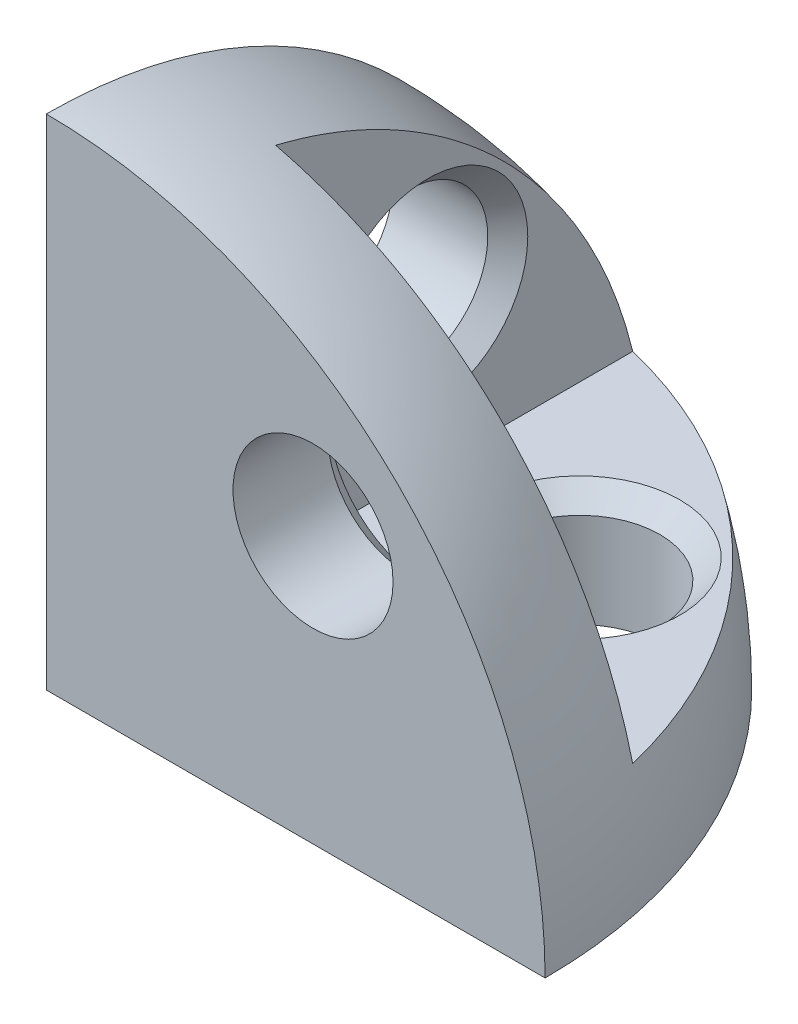
ISO-10303-21;
HEADER;
FILE_DESCRIPTION(('STEP AP214'),'2;1');
FILE_NAME('part.step','',(''),(''),'','','');
FILE_SCHEMA(('AUTOMOTIVE_DESIGN { 1 0 10303 214 1 1 1 1 }'));
ENDSEC;
DATA;
#1=APPLICATION_CONTEXT('core data for automotive mechanical design processes');
#2=APPLICATION_PROTOCOL_DEFINITION('international standard','automotive_design',2000,#1);
#3=PRODUCT_CONTEXT('',#1,'mechanical');
#4=PRODUCT('Part','Part','',(#3));
#5=PRODUCT_RELATED_PRODUCT_CATEGORY('part','',(#4));
#6=PRODUCT_DEFINITION_FORMATION('','',#4);
#7=PRODUCT_DEFINITION_CONTEXT('part definition',#1,'design');
#8=PRODUCT_DEFINITION('design','',#6,#7);
#9=PRODUCT_DEFINITION_SHAPE('','',#8);
#10=(LENGTH_UNIT() NAMED_UNIT(*) SI_UNIT(.MILLI.,.METRE.));
#11=(NAMED_UNIT(*) PLANE_ANGLE_UNIT() SI_UNIT($,.RADIAN.));
#12=(NAMED_UNIT(*) SI_UNIT($,.STERADIAN.) SOLID_ANGLE_UNIT());
#13=UNCERTAINTY_MEASURE_WITH_UNIT(LENGTH_MEASURE(1.E-05),#10,'distance_accuracy_value','');
#14=(GEOMETRIC_REPRESENTATION_CONTEXT(3) GLOBAL_UNCERTAINTY_ASSIGNED_CONTEXT((#13)) GLOBAL_UNIT_ASSIGNED_CONTEXT((#10,
#11,#12)) REPRESENTATION_CONTEXT('',''));
#15=CARTESIAN_POINT('',(0.,0.,0.));
#16=DIRECTION('',(0.,0.,1.));
#17=DIRECTION('',(1.,0.,0.));
#18=AXIS2_PLACEMENT_3D('',#15,#16,#17);
#19=CARTESIAN_POINT('',(0.,0.,0.));
#20=DIRECTION('',(0.,-1.,0.));
#21=DIRECTION('',(0.,0.,-1.));
#22=AXIS2_PLACEMENT_3D('',#19,#20,#21);
#23=SPHERICAL_SURFACE('',#22,18.7);
#24=CARTESIAN_POINT('',(0.,0.,0.));
#25=DIRECTION('',(0.,0.,1.));
#26=DIRECTION('',(1.,0.,0.));
#27=AXIS2_PLACEMENT_3D('',#24,#25,#26);
#28=CIRCLE('',#27,18.7);
#29=CARTESIAN_POINT('',(18.7,0.,0.));
#30=VERTEX_POINT('',#29);
#31=CARTESIAN_POINT('',(0.,18.7,0.));
#32=VERTEX_POINT('',#31);
#33=EDGE_CURVE('E102',#30,#32,#28,.T.);
#34=ORIENTED_EDGE('',*,*,#33,.F.);
#35=CARTESIAN_POINT('',(0.,0.,0.));
#36=DIRECTION('',(0.,-1.,0.));
#37=DIRECTION('',(0.,0.,-1.));
#38=AXIS2_PLACEMENT_3D('',#35,#36,#37);
#39=CIRCLE('',#38,18.7);
#40=CARTESIAN_POINT('',(0.,0.,-18.7));
#41=VERTEX_POINT('',#40);
#42=EDGE_CURVE('E112',#41,#30,#39,.T.);
#43=ORIENTED_EDGE('',*,*,#42,.F.);
#44=CARTESIAN_POINT('',(0.,0.,0.));
#45=DIRECTION('',(1.,0.,0.));
#46=DIRECTION('',(0.,0.,-1.));
#47=AXIS2_PLACEMENT_3D('',#44,#45,#46);
#48=CIRCLE('',#47,18.7);
#49=EDGE_CURVE('E107',#41,#32,#48,.T.);
#50=ORIENTED_EDGE('',*,*,#49,.T.);
#51=EDGE_LOOP('',(#34,#43,#50));
#52=FACE_BOUND('',#51,.T.);
#53=CARTESIAN_POINT('',(0.,4.3,0.));
#54=DIRECTION('',(0.,-1.,0.));
#55=DIRECTION('',(0.,0.,-1.));
#56=AXIS2_PLACEMENT_3D('',#53,#54,#55);
#57=CIRCLE('',#56,18.1989010657237);
#58=CARTESIAN_POINT('',(4.29999999999994,4.3,-17.6836082290917));
#59=VERTEX_POINT('',#58);
#60=CARTESIAN_POINT('',(17.6836082290917,4.3,-4.3));
#61=VERTEX_POINT('',#60);
#62=EDGE_CURVE('E91',#59,#61,#57,.T.);
#63=ORIENTED_EDGE('',*,*,#62,.T.);
#64=CARTESIAN_POINT('',(0.,0.,-4.3));
#65=DIRECTION('',(0.,0.,1.));
#66=DIRECTION('',(1.,0.,0.));
#67=AXIS2_PLACEMENT_3D('',#64,#65,#66);
#68=CIRCLE('',#67,18.1989010657237);
#69=CARTESIAN_POINT('',(4.29999999999999,17.6836082290917,-4.3));
#70=VERTEX_POINT('',#69);
#71=EDGE_CURVE('E85',#61,#70,#68,.T.);
#72=ORIENTED_EDGE('',*,*,#71,.T.);
#73=CARTESIAN_POINT('',(4.3,0.,0.));
#74=DIRECTION('',(1.,0.,0.));
#75=DIRECTION('',(0.,0.,-1.));
#76=AXIS2_PLACEMENT_3D('',#73,#74,#75);
#77=CIRCLE('',#76,18.1989010657237);
#78=EDGE_CURVE('E93',#59,#70,#77,.T.);
#79=ORIENTED_EDGE('',*,*,#78,.F.);
#80=EDGE_LOOP('',(#63,#72,#79));
#81=FACE_BOUND('',#80,.T.);
#82=ADVANCED_FACE('F38',(#52,#81),#23,.T.);
#83=CARTESIAN_POINT('',(0.,0.,0.));
#84=DIRECTION('',(0.,-1.,0.));
#85=DIRECTION('',(0.,0.,-1.));
#86=AXIS2_PLACEMENT_3D('',#83,#84,#85);
#87=PLANE('',#86);
#88=CARTESIAN_POINT('',(10.,0.,-10.));
#89=DIRECTION('',(0.,-1.,0.));
#90=DIRECTION('',(0.,0.,-1.));
#91=AXIS2_PLACEMENT_3D('',#88,#89,#90);
#92=CIRCLE('',#91,3.);
#93=CARTESIAN_POINT('',(10.,0.,-13.));
#94=VERTEX_POINT('',#93);
#95=EDGE_CURVE('E193',#94,#94,#92,.T.);
#96=ORIENTED_EDGE('',*,*,#95,.F.);
#97=EDGE_LOOP('',(#96));
#98=FACE_BOUND('',#97,.T.);
#99=ORIENTED_EDGE('',*,*,#42,.T.);
#100=DIRECTION('',(1.,0.,0.));
#101=VECTOR('',#100,1.);
#102=CARTESIAN_POINT('',(0.,0.,0.));
#103=LINE('',#102,#101);
#104=CARTESIAN_POINT('',(0.,0.,0.));
#105=VERTEX_POINT('',#104);
#106=EDGE_CURVE('E61',#105,#30,#103,.T.);
#107=ORIENTED_EDGE('',*,*,#106,.F.);
#108=DIRECTION('',(0.,0.,-1.));
#109=VECTOR('',#108,1.);
#110=CARTESIAN_POINT('',(0.,0.,0.));
#111=LINE('',#110,#109);
#112=EDGE_CURVE('E105',#105,#41,#111,.T.);
#113=ORIENTED_EDGE('',*,*,#112,.T.);
#114=EDGE_LOOP('',(#99,#107,#113));
#115=FACE_BOUND('',#114,.T.);
#116=ADVANCED_FACE('F139',(#98,#115),#87,.T.);
#117=CARTESIAN_POINT('',(0.,0.,0.));
#118=DIRECTION('',(1.,0.,0.));
#119=DIRECTION('',(0.,0.,-1.));
#120=AXIS2_PLACEMENT_3D('',#117,#118,#119);
#121=PLANE('',#120);
#122=CARTESIAN_POINT('',(0.,10.,-10.));
#123=DIRECTION('',(-1.,0.,0.));
#124=DIRECTION('',(0.,0.,1.));
#125=AXIS2_PLACEMENT_3D('',#122,#123,#124);
#126=CIRCLE('',#125,3.);
#127=CARTESIAN_POINT('',(0.,10.,-7.));
#128=VERTEX_POINT('',#127);
#129=EDGE_CURVE('E188',#128,#128,#126,.T.);
#130=ORIENTED_EDGE('',*,*,#129,.F.);
#131=EDGE_LOOP('',(#130));
#132=FACE_BOUND('',#131,.T.);
#133=ORIENTED_EDGE('',*,*,#112,.F.);
#134=DIRECTION('',(0.,1.,0.));
#135=VECTOR('',#134,1.);
#136=CARTESIAN_POINT('',(0.,0.,0.));
#137=LINE('',#136,#135);
#138=EDGE_CURVE('E110',#105,#32,#137,.T.);
#139=ORIENTED_EDGE('',*,*,#138,.T.);
#140=ORIENTED_EDGE('',*,*,#49,.F.);
#141=EDGE_LOOP('',(#133,#139,#140));
#142=FACE_BOUND('',#141,.T.);
#143=ADVANCED_FACE('F145',(#132,#142),#121,.F.);
#144=CARTESIAN_POINT('',(0.,0.,0.));
#145=DIRECTION('',(0.,0.,1.));
#146=DIRECTION('',(1.,0.,0.));
#147=AXIS2_PLACEMENT_3D('',#144,#145,#146);
#148=PLANE('',#147);
#149=CARTESIAN_POINT('',(10.,10.,0.));
#150=DIRECTION('',(0.,0.,1.));
#151=DIRECTION('',(1.,0.,0.));
#152=AXIS2_PLACEMENT_3D('',#149,#150,#151);
#153=CIRCLE('',#152,3.);
#154=CARTESIAN_POINT('',(13.,10.,0.));
#155=VERTEX_POINT('',#154);
#156=EDGE_CURVE('E88',#155,#155,#153,.T.);
#157=ORIENTED_EDGE('',*,*,#156,.F.);
#158=EDGE_LOOP('',(#157));
#159=FACE_BOUND('',#158,.T.);
#160=ORIENTED_EDGE('',*,*,#106,.T.);
#161=ORIENTED_EDGE('',*,*,#33,.T.);
#162=ORIENTED_EDGE('',*,*,#138,.F.);
#163=EDGE_LOOP('',(#160,#161,#162));
#164=FACE_BOUND('',#163,.T.);
#165=ADVANCED_FACE('F166',(#159,#164),#148,.T.);
#166=CARTESIAN_POINT('',(0.,4.3,0.));
#167=DIRECTION('',(0.,-1.,0.));
#168=DIRECTION('',(0.,0.,-1.));
#169=AXIS2_PLACEMENT_3D('',#166,#167,#168);
#170=PLANE('',#169);
#171=CARTESIAN_POINT('',(10.,4.3,-10.));
#172=DIRECTION('',(0.,-1.,0.));
#173=DIRECTION('',(0.,0.,-1.));
#174=AXIS2_PLACEMENT_3D('',#171,#172,#173);
#175=CIRCLE('',#174,3.75);
#176=CARTESIAN_POINT('',(10.,4.3,-13.75));
#177=VERTEX_POINT('',#176);
#178=EDGE_CURVE('E114',#177,#177,#175,.T.);
#179=ORIENTED_EDGE('',*,*,#178,.T.);
#180=EDGE_LOOP('',(#179));
#181=FACE_BOUND('',#180,.T.);
#182=ORIENTED_EDGE('',*,*,#62,.F.);
#183=DIRECTION('',(0.,0.,-1.));
#184=VECTOR('',#183,1.);
#185=CARTESIAN_POINT('',(4.3,4.3,0.));
#186=LINE('',#185,#184);
#187=CARTESIAN_POINT('',(4.29999999999999,4.3,-4.3));
#188=VERTEX_POINT('',#187);
#189=EDGE_CURVE('E53',#188,#59,#186,.T.);
#190=ORIENTED_EDGE('',*,*,#189,.F.);
#191=DIRECTION('',(1.,0.,0.));
#192=VECTOR('',#191,1.);
#193=CARTESIAN_POINT('',(0.,4.3,-4.3));
#194=LINE('',#193,#192);
#195=EDGE_CURVE('E81',#188,#61,#194,.T.);
#196=ORIENTED_EDGE('',*,*,#195,.T.);
#197=EDGE_LOOP('',(#182,#190,#196));
#198=FACE_BOUND('',#197,.T.);
#199=ADVANCED_FACE('F90',(#181,#198),#170,.F.);
#200=CARTESIAN_POINT('',(4.3,0.,0.));
#201=DIRECTION('',(1.,0.,0.));
#202=DIRECTION('',(0.,0.,-1.));
#203=AXIS2_PLACEMENT_3D('',#200,#201,#202);
#204=PLANE('',#203);
#205=CARTESIAN_POINT('',(4.29999999999997,10.,-10.));
#206=DIRECTION('',(1.,0.,0.));
#207=DIRECTION('',(0.,0.,-1.));
#208=AXIS2_PLACEMENT_3D('',#205,#206,#207);
#209=CIRCLE('',#208,3.75);
#210=CARTESIAN_POINT('',(4.29999999999995,10.,-13.75));
#211=VERTEX_POINT('',#210);
#212=EDGE_CURVE('E123',#211,#211,#209,.F.);
#213=ORIENTED_EDGE('',*,*,#212,.T.);
#214=EDGE_LOOP('',(#213));
#215=FACE_BOUND('',#214,.T.);
#216=ORIENTED_EDGE('',*,*,#189,.T.);
#217=ORIENTED_EDGE('',*,*,#78,.T.);
#218=DIRECTION('',(0.,1.,0.));
#219=VECTOR('',#218,1.);
#220=CARTESIAN_POINT('',(4.29999999999999,0.,-4.3));
#221=LINE('',#220,#219);
#222=EDGE_CURVE('E83',#188,#70,#221,.T.);
#223=ORIENTED_EDGE('',*,*,#222,.F.);
#224=EDGE_LOOP('',(#216,#217,#223));
#225=FACE_BOUND('',#224,.T.);
#226=ADVANCED_FACE('F95',(#215,#225),#204,.T.);
#227=CARTESIAN_POINT('',(0.,0.,-4.3));
#228=DIRECTION('',(0.,0.,1.));
#229=DIRECTION('',(1.,0.,0.));
#230=AXIS2_PLACEMENT_3D('',#227,#228,#229);
#231=PLANE('',#230);
#232=CARTESIAN_POINT('',(10.,10.,-4.3));
#233=DIRECTION('',(0.,0.,1.));
#234=DIRECTION('',(1.,0.,0.));
#235=AXIS2_PLACEMENT_3D('',#232,#233,#234);
#236=CIRCLE('',#235,3.75);
#237=CARTESIAN_POINT('',(13.75,10.,-4.3));
#238=VERTEX_POINT('',#237);
#239=EDGE_CURVE('E46',#238,#238,#236,.T.);
#240=ORIENTED_EDGE('',*,*,#239,.T.);
#241=EDGE_LOOP('',(#240));
#242=FACE_BOUND('',#241,.T.);
#243=ORIENTED_EDGE('',*,*,#195,.F.);
#244=ORIENTED_EDGE('',*,*,#222,.T.);
#245=ORIENTED_EDGE('',*,*,#71,.F.);
#246=EDGE_LOOP('',(#243,#244,#245));
#247=FACE_BOUND('',#246,.T.);
#248=ADVANCED_FACE('F82',(#242,#247),#231,.F.);
#249=CARTESIAN_POINT('',(10.,10.,-10.));
#250=DIRECTION('',(0.,0.,1.));
#251=DIRECTION('',(1.,0.,0.));
#252=AXIS2_PLACEMENT_3D('',#249,#250,#251);
#253=CYLINDRICAL_SURFACE('',#252,3.);
#254=CARTESIAN_POINT('',(10.,10.,-3.55));
#255=DIRECTION('',(0.,0.,1.));
#256=DIRECTION('',(1.,0.,0.));
#257=AXIS2_PLACEMENT_3D('',#254,#255,#256);
#258=CIRCLE('',#257,3.);
#259=CARTESIAN_POINT('',(13.,10.,-3.55));
#260=VERTEX_POINT('',#259);
#261=EDGE_CURVE('E11',#260,#260,#258,.F.);
#262=ORIENTED_EDGE('',*,*,#261,.T.);
#263=EDGE_LOOP('',(#262));
#264=FACE_BOUND('',#263,.T.);
#265=ORIENTED_EDGE('',*,*,#156,.T.);
#266=EDGE_LOOP('',(#265));
#267=FACE_BOUND('',#266,.T.);
#268=ADVANCED_FACE('F177',(#264,#267),#253,.F.);
#269=CARTESIAN_POINT('',(10.,10.,-10.));
#270=DIRECTION('',(0.,-1.,0.));
#271=DIRECTION('',(0.,0.,-1.));
#272=AXIS2_PLACEMENT_3D('',#269,#270,#271);
#273=CYLINDRICAL_SURFACE('',#272,3.);
#274=CARTESIAN_POINT('',(10.,3.55,-10.));
#275=DIRECTION('',(0.,-1.,0.));
#276=DIRECTION('',(0.,0.,-1.));
#277=AXIS2_PLACEMENT_3D('',#274,#275,#276);
#278=CIRCLE('',#277,3.);
#279=CARTESIAN_POINT('',(10.,3.55,-13.));
#280=VERTEX_POINT('',#279);
#281=EDGE_CURVE('E117',#280,#280,#278,.F.);
#282=ORIENTED_EDGE('',*,*,#281,.T.);
#283=EDGE_LOOP('',(#282));
#284=FACE_BOUND('',#283,.T.);
#285=ORIENTED_EDGE('',*,*,#95,.T.);
#286=EDGE_LOOP('',(#285));
#287=FACE_BOUND('',#286,.T.);
#288=ADVANCED_FACE('F158',(#284,#287),#273,.F.);
#289=CARTESIAN_POINT('',(9.99999999999997,10.,-10.));
#290=DIRECTION('',(-1.,0.,0.));
#291=DIRECTION('',(0.,0.,1.));
#292=AXIS2_PLACEMENT_3D('',#289,#290,#291);
#293=CYLINDRICAL_SURFACE('',#292,3.);
#294=CARTESIAN_POINT('',(3.54999999999997,10.,-10.));
#295=DIRECTION('',(1.,0.,0.));
#296=DIRECTION('',(0.,0.,-1.));
#297=AXIS2_PLACEMENT_3D('',#294,#295,#296);
#298=CIRCLE('',#297,3.);
#299=CARTESIAN_POINT('',(3.54999999999995,10.,-13.));
#300=VERTEX_POINT('',#299);
#301=EDGE_CURVE('E120',#300,#300,#298,.T.);
#302=ORIENTED_EDGE('',*,*,#301,.T.);
#303=EDGE_LOOP('',(#302));
#304=FACE_BOUND('',#303,.T.);
#305=ORIENTED_EDGE('',*,*,#129,.T.);
#306=EDGE_LOOP('',(#305));
#307=FACE_BOUND('',#306,.T.);
#308=ADVANCED_FACE('F153',(#304,#307),#293,.F.);
#309=CARTESIAN_POINT('',(10.,4.3,-10.));
#310=DIRECTION('',(0.,1.,0.));
#311=DIRECTION('',(0.,0.,1.));
#312=AXIS2_PLACEMENT_3D('',#309,#310,#311);
#313=CONICAL_SURFACE('',#312,3.75,0.785398163397448);
#314=ORIENTED_EDGE('',*,*,#281,.F.);
#315=EDGE_LOOP('',(#314));
#316=FACE_BOUND('',#315,.T.);
#317=ORIENTED_EDGE('',*,*,#178,.F.);
#318=EDGE_LOOP('',(#317));
#319=FACE_BOUND('',#318,.T.);
#320=ADVANCED_FACE('F135',(#316,#319),#313,.F.);
#321=CARTESIAN_POINT('',(3.54999999999997,10.,-10.));
#322=DIRECTION('',(1.,0.,0.));
#323=DIRECTION('',(0.,0.,-1.));
#324=AXIS2_PLACEMENT_3D('',#321,#322,#323);
#325=CONICAL_SURFACE('',#324,3.,0.785398163397447);
#326=ORIENTED_EDGE('',*,*,#212,.F.);
#327=EDGE_LOOP('',(#326));
#328=FACE_BOUND('',#327,.T.);
#329=ORIENTED_EDGE('',*,*,#301,.F.);
#330=EDGE_LOOP('',(#329));
#331=FACE_BOUND('',#330,.T.);
#332=ADVANCED_FACE('F130',(#328,#331),#325,.F.);
#333=CARTESIAN_POINT('',(10.,10.,-4.3));
#334=DIRECTION('',(0.,0.,-1.));
#335=DIRECTION('',(-1.,0.,0.));
#336=AXIS2_PLACEMENT_3D('',#333,#334,#335);
#337=CONICAL_SURFACE('',#336,3.75,0.785398163397448);
#338=ORIENTED_EDGE('',*,*,#261,.F.);
#339=EDGE_LOOP('',(#338));
#340=FACE_BOUND('',#339,.T.);
#341=ORIENTED_EDGE('',*,*,#239,.F.);
#342=EDGE_LOOP('',(#341));
#343=FACE_BOUND('',#342,.T.);
#344=ADVANCED_FACE('F40',(#340,#343),#337,.F.);
#345=CLOSED_SHELL('',(#82,#116,#143,#165,#199,#226,#248,#268,#288,#308,#320,#332,#344));
#346=MANIFOLD_SOLID_BREP('B2',#345);
#347=ADVANCED_BREP_SHAPE_REPRESENTATION('',(#18,#346),#14);
#348=SHAPE_DEFINITION_REPRESENTATION(#9,#347);
ENDSEC;
END-ISO-10303-21;
